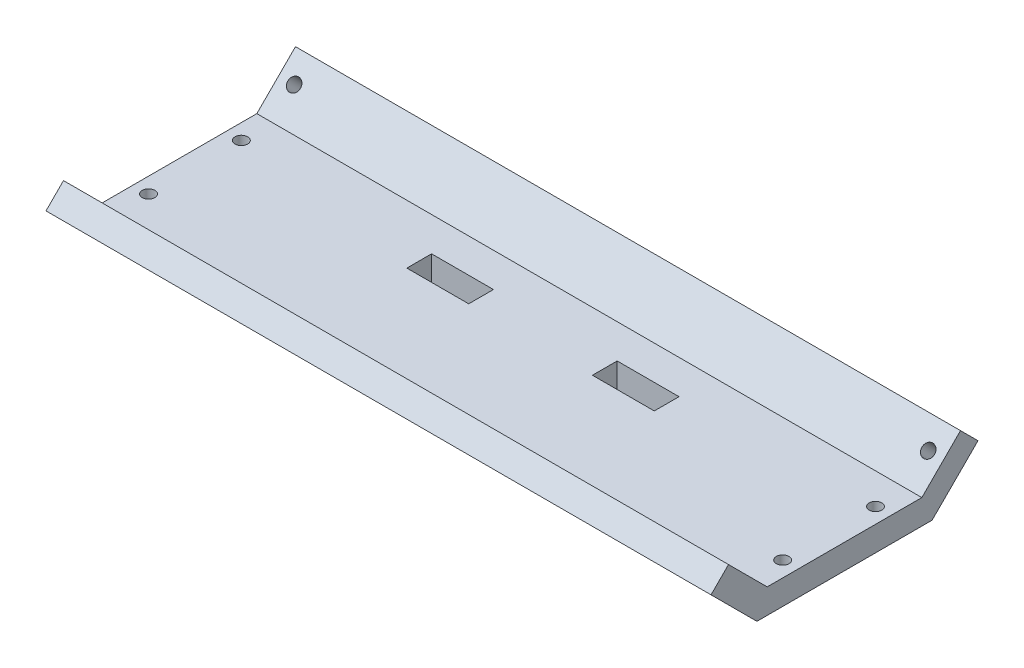
ISO-10303-21;
HEADER;
FILE_DESCRIPTION(('STEP AP214'),'2;1');
FILE_NAME('part.step','',(''),(''),'','','');
FILE_SCHEMA(('AUTOMOTIVE_DESIGN { 1 0 10303 214 1 1 1 1 }'));
ENDSEC;
DATA;
#1=APPLICATION_CONTEXT('core data for automotive mechanical design processes');
#2=APPLICATION_PROTOCOL_DEFINITION('international standard','automotive_design',2000,#1);
#3=PRODUCT_CONTEXT('',#1,'mechanical');
#4=PRODUCT('Part','Part','',(#3));
#5=PRODUCT_RELATED_PRODUCT_CATEGORY('part','',(#4));
#6=PRODUCT_DEFINITION_FORMATION('','',#4);
#7=PRODUCT_DEFINITION_CONTEXT('part definition',#1,'design');
#8=PRODUCT_DEFINITION('design','',#6,#7);
#9=PRODUCT_DEFINITION_SHAPE('','',#8);
#10=(LENGTH_UNIT() NAMED_UNIT(*) SI_UNIT(.MILLI.,.METRE.));
#11=(NAMED_UNIT(*) PLANE_ANGLE_UNIT() SI_UNIT($,.RADIAN.));
#12=(NAMED_UNIT(*) SI_UNIT($,.STERADIAN.) SOLID_ANGLE_UNIT());
#13=UNCERTAINTY_MEASURE_WITH_UNIT(LENGTH_MEASURE(1.E-05),#10,'distance_accuracy_value','');
#14=(GEOMETRIC_REPRESENTATION_CONTEXT(3) GLOBAL_UNCERTAINTY_ASSIGNED_CONTEXT((#13)) GLOBAL_UNIT_ASSIGNED_CONTEXT((#10,
#11,#12)) REPRESENTATION_CONTEXT('',''));
#15=CARTESIAN_POINT('',(0.,0.,0.));
#16=DIRECTION('',(0.,0.,1.));
#17=DIRECTION('',(1.,0.,0.));
#18=AXIS2_PLACEMENT_3D('',#15,#16,#17);
#19=CARTESIAN_POINT('',(107.5,12.4999999999999,37.5000000000001));
#20=DIRECTION('',(0.,-0.707106781186547,-0.707106781186548));
#21=DIRECTION('',(0.,0.707106781186548,-0.707106781186547));
#22=AXIS2_PLACEMENT_3D('',#19,#20,#21);
#23=PLANE('',#22);
#24=DIRECTION('',(0.,-0.707106781186548,0.707106781186547));
#25=VECTOR('',#24,1.);
#26=CARTESIAN_POINT('',(-107.5,12.4999999999999,37.5000000000001));
#27=LINE('',#26,#25);
#28=CARTESIAN_POINT('',(-107.5,12.4999999999999,37.5000000000001));
#29=VERTEX_POINT('',#28);
#30=CARTESIAN_POINT('',(-107.5,6.84314575050755,43.1568542494924));
#31=VERTEX_POINT('',#30);
#32=EDGE_CURVE('E266',#29,#31,#27,.T.);
#33=ORIENTED_EDGE('',*,*,#32,.T.);
#34=DIRECTION('',(-1.,0.,0.));
#35=VECTOR('',#34,1.);
#36=CARTESIAN_POINT('',(107.5,6.84314575050755,43.1568542494924));
#37=LINE('',#36,#35);
#38=CARTESIAN_POINT('',(107.5,6.84314575050755,43.1568542494924));
#39=VERTEX_POINT('',#38);
#40=EDGE_CURVE('E11',#39,#31,#37,.T.);
#41=ORIENTED_EDGE('',*,*,#40,.F.);
#42=DIRECTION('',(0.,-0.707106781186548,0.707106781186547));
#43=VECTOR('',#42,1.);
#44=CARTESIAN_POINT('',(107.5,12.4999999999999,37.5000000000001));
#45=LINE('',#44,#43);
#46=CARTESIAN_POINT('',(107.5,12.4999999999999,37.5000000000001));
#47=VERTEX_POINT('',#46);
#48=EDGE_CURVE('E267',#47,#39,#45,.T.);
#49=ORIENTED_EDGE('',*,*,#48,.F.);
#50=DIRECTION('',(-1.,0.,0.));
#51=VECTOR('',#50,1.);
#52=CARTESIAN_POINT('',(107.5,12.4999999999999,37.5000000000001));
#53=LINE('',#52,#51);
#54=EDGE_CURVE('E285',#47,#29,#53,.T.);
#55=ORIENTED_EDGE('',*,*,#54,.T.);
#56=EDGE_LOOP('',(#33,#41,#49,#55));
#57=FACE_BOUND('',#56,.T.);
#58=ADVANCED_FACE('F38',(#57),#23,.F.);
#59=CARTESIAN_POINT('',(107.5,-8.,28.313708498985));
#60=DIRECTION('',(0.,0.707106781186545,-0.707106781186551));
#61=DIRECTION('',(0.,0.707106781186551,0.707106781186545));
#62=AXIS2_PLACEMENT_3D('',#59,#60,#61);
#63=PLANE('',#62);
#64=CARTESIAN_POINT('',(-102.5,1.414213562373,37.7279220613579));
#65=DIRECTION('',(0.,0.707106781186545,-0.707106781186551));
#66=DIRECTION('',(0.,0.707106781186551,0.707106781186545));
#67=AXIS2_PLACEMENT_3D('',#64,#65,#66);
#68=CIRCLE('',#67,2.04999999999999);
#69=CARTESIAN_POINT('',(-102.5,2.86378246380542,39.1774909627903));
#70=VERTEX_POINT('',#69);
#71=EDGE_CURVE('E242',#70,#70,#68,.T.);
#72=ORIENTED_EDGE('',*,*,#71,.T.);
#73=EDGE_LOOP('',(#72));
#74=FACE_BOUND('',#73,.T.);
#75=CARTESIAN_POINT('',(102.5,1.414213562373,37.7279220613579));
#76=DIRECTION('',(0.,0.707106781186545,-0.707106781186551));
#77=DIRECTION('',(0.,0.707106781186551,0.707106781186545));
#78=AXIS2_PLACEMENT_3D('',#75,#76,#77);
#79=CIRCLE('',#78,2.04999999999999);
#80=CARTESIAN_POINT('',(102.5,2.86378246380542,39.1774909627903));
#81=VERTEX_POINT('',#80);
#82=EDGE_CURVE('E41',#81,#81,#79,.T.);
#83=ORIENTED_EDGE('',*,*,#82,.T.);
#84=EDGE_LOOP('',(#83));
#85=FACE_BOUND('',#84,.T.);
#86=DIRECTION('',(0.,-0.707106781186551,-0.707106781186545));
#87=VECTOR('',#86,1.);
#88=CARTESIAN_POINT('',(-107.5,-8.,28.313708498985));
#89=LINE('',#88,#87);
#90=CARTESIAN_POINT('',(-107.5,-8.,28.313708498985));
#91=VERTEX_POINT('',#90);
#92=EDGE_CURVE('E288',#31,#91,#89,.T.);
#93=ORIENTED_EDGE('',*,*,#92,.T.);
#94=DIRECTION('',(-1.,0.,0.));
#95=VECTOR('',#94,1.);
#96=CARTESIAN_POINT('',(107.5,-8.,28.313708498985));
#97=LINE('',#96,#95);
#98=CARTESIAN_POINT('',(107.5,-8.,28.313708498985));
#99=VERTEX_POINT('',#98);
#100=EDGE_CURVE('E46',#99,#91,#97,.T.);
#101=ORIENTED_EDGE('',*,*,#100,.F.);
#102=DIRECTION('',(0.,-0.707106781186551,-0.707106781186545));
#103=VECTOR('',#102,1.);
#104=CARTESIAN_POINT('',(107.5,-8.,28.313708498985));
#105=LINE('',#104,#103);
#106=EDGE_CURVE('E270',#39,#99,#105,.T.);
#107=ORIENTED_EDGE('',*,*,#106,.F.);
#108=ORIENTED_EDGE('',*,*,#40,.T.);
#109=EDGE_LOOP('',(#93,#101,#107,#108));
#110=FACE_BOUND('',#109,.T.);
#111=ADVANCED_FACE('F345',(#74,#85,#110),#63,.F.);
#112=CARTESIAN_POINT('',(107.5,-8.,28.313708498985));
#113=DIRECTION('',(0.,1.,0.));
#114=DIRECTION('',(0.,0.,1.));
#115=AXIS2_PLACEMENT_3D('',#112,#113,#114);
#116=PLANE('',#115);
#117=DIRECTION('',(1.,0.,0.));
#118=VECTOR('',#117,1.);
#119=CARTESIAN_POINT('',(20.,-8.,-6.));
#120=LINE('',#119,#118);
#121=CARTESIAN_POINT('',(20.,-8.,-6.));
#122=VERTEX_POINT('',#121);
#123=CARTESIAN_POINT('',(40.,-8.,-6.));
#124=VERTEX_POINT('',#123);
#125=EDGE_CURVE('E163',#122,#124,#120,.T.);
#126=ORIENTED_EDGE('',*,*,#125,.T.);
#127=DIRECTION('',(0.,0.,-1.));
#128=VECTOR('',#127,1.);
#129=CARTESIAN_POINT('',(40.,-8.,-14.));
#130=LINE('',#129,#128);
#131=CARTESIAN_POINT('',(40.,-8.,-14.));
#132=VERTEX_POINT('',#131);
#133=EDGE_CURVE('E155',#124,#132,#130,.T.);
#134=ORIENTED_EDGE('',*,*,#133,.T.);
#135=DIRECTION('',(-1.,0.,0.));
#136=VECTOR('',#135,1.);
#137=CARTESIAN_POINT('',(20.,-8.,-14.));
#138=LINE('',#137,#136);
#139=CARTESIAN_POINT('',(20.,-8.,-14.));
#140=VERTEX_POINT('',#139);
#141=EDGE_CURVE('E166',#132,#140,#138,.T.);
#142=ORIENTED_EDGE('',*,*,#141,.T.);
#143=DIRECTION('',(0.,0.,1.));
#144=VECTOR('',#143,1.);
#145=CARTESIAN_POINT('',(20.,-8.,-14.));
#146=LINE('',#145,#144);
#147=EDGE_CURVE('E53',#140,#122,#146,.T.);
#148=ORIENTED_EDGE('',*,*,#147,.T.);
#149=EDGE_LOOP('',(#126,#134,#142,#148));
#150=FACE_BOUND('',#149,.T.);
#151=DIRECTION('',(1.,0.,0.));
#152=VECTOR('',#151,1.);
#153=CARTESIAN_POINT('',(-40.,-8.,-6.));
#154=LINE('',#153,#152);
#155=CARTESIAN_POINT('',(-40.,-8.,-6.));
#156=VERTEX_POINT('',#155);
#157=CARTESIAN_POINT('',(-20.,-8.,-6.));
#158=VERTEX_POINT('',#157);
#159=EDGE_CURVE('E196',#156,#158,#154,.T.);
#160=ORIENTED_EDGE('',*,*,#159,.T.);
#161=DIRECTION('',(0.,0.,-1.));
#162=VECTOR('',#161,1.);
#163=CARTESIAN_POINT('',(-20.,-8.,-14.));
#164=LINE('',#163,#162);
#165=CARTESIAN_POINT('',(-20.,-8.,-14.));
#166=VERTEX_POINT('',#165);
#167=EDGE_CURVE('E207',#158,#166,#164,.T.);
#168=ORIENTED_EDGE('',*,*,#167,.T.);
#169=DIRECTION('',(-1.,0.,0.));
#170=VECTOR('',#169,1.);
#171=CARTESIAN_POINT('',(-40.,-8.,-14.));
#172=LINE('',#171,#170);
#173=CARTESIAN_POINT('',(-40.,-8.,-14.));
#174=VERTEX_POINT('',#173);
#175=EDGE_CURVE('E217',#166,#174,#172,.T.);
#176=ORIENTED_EDGE('',*,*,#175,.T.);
#177=DIRECTION('',(0.,0.,1.));
#178=VECTOR('',#177,1.);
#179=CARTESIAN_POINT('',(-40.,-8.,-14.));
#180=LINE('',#179,#178);
#181=EDGE_CURVE('E61',#174,#156,#180,.T.);
#182=ORIENTED_EDGE('',*,*,#181,.T.);
#183=EDGE_LOOP('',(#160,#168,#176,#182));
#184=FACE_BOUND('',#183,.T.);
#185=CARTESIAN_POINT('',(-102.5,-8.,-15.0000000000001));
#186=DIRECTION('',(0.,1.,0.));
#187=DIRECTION('',(0.,0.,1.));
#188=AXIS2_PLACEMENT_3D('',#185,#186,#187);
#189=CIRCLE('',#188,2.05);
#190=CARTESIAN_POINT('',(-102.5,-8.,-12.9500000000001));
#191=VERTEX_POINT('',#190);
#192=EDGE_CURVE('E230',#191,#191,#189,.T.);
#193=ORIENTED_EDGE('',*,*,#192,.T.);
#194=EDGE_LOOP('',(#193));
#195=FACE_BOUND('',#194,.T.);
#196=CARTESIAN_POINT('',(-102.5,-8.,15.0000000000001));
#197=DIRECTION('',(0.,1.,0.));
#198=DIRECTION('',(0.,0.,1.));
#199=AXIS2_PLACEMENT_3D('',#196,#197,#198);
#200=CIRCLE('',#199,2.05);
#201=CARTESIAN_POINT('',(-102.5,-8.,17.0500000000001));
#202=VERTEX_POINT('',#201);
#203=EDGE_CURVE('E236',#202,#202,#200,.T.);
#204=ORIENTED_EDGE('',*,*,#203,.T.);
#205=EDGE_LOOP('',(#204));
#206=FACE_BOUND('',#205,.T.);
#207=CARTESIAN_POINT('',(102.5,-8.,15.0000000000001));
#208=DIRECTION('',(0.,1.,0.));
#209=DIRECTION('',(0.,0.,1.));
#210=AXIS2_PLACEMENT_3D('',#207,#208,#209);
#211=CIRCLE('',#210,2.05);
#212=CARTESIAN_POINT('',(102.5,-8.,17.0500000000001));
#213=VERTEX_POINT('',#212);
#214=EDGE_CURVE('E251',#213,#213,#211,.T.);
#215=ORIENTED_EDGE('',*,*,#214,.T.);
#216=EDGE_LOOP('',(#215));
#217=FACE_BOUND('',#216,.T.);
#218=CARTESIAN_POINT('',(102.5,-8.,-15.0000000000001));
#219=DIRECTION('',(0.,1.,0.));
#220=DIRECTION('',(0.,0.,1.));
#221=AXIS2_PLACEMENT_3D('',#218,#219,#220);
#222=CIRCLE('',#221,2.05);
#223=CARTESIAN_POINT('',(102.5,-8.,-12.9500000000001));
#224=VERTEX_POINT('',#223);
#225=EDGE_CURVE('E257',#224,#224,#222,.T.);
#226=ORIENTED_EDGE('',*,*,#225,.T.);
#227=EDGE_LOOP('',(#226));
#228=FACE_BOUND('',#227,.T.);
#229=DIRECTION('',(0.,0.,-1.));
#230=VECTOR('',#229,1.);
#231=CARTESIAN_POINT('',(-107.5,-8.,28.313708498985));
#232=LINE('',#231,#230);
#233=CARTESIAN_POINT('',(-107.5,-8.,-28.3137084989848));
#234=VERTEX_POINT('',#233);
#235=EDGE_CURVE('E290',#91,#234,#232,.T.);
#236=ORIENTED_EDGE('',*,*,#235,.T.);
#237=DIRECTION('',(-1.,0.,0.));
#238=VECTOR('',#237,1.);
#239=CARTESIAN_POINT('',(107.5,-8.,-28.3137084989848));
#240=LINE('',#239,#238);
#241=CARTESIAN_POINT('',(107.5,-8.,-28.3137084989848));
#242=VERTEX_POINT('',#241);
#243=EDGE_CURVE('E315',#242,#234,#240,.T.);
#244=ORIENTED_EDGE('',*,*,#243,.F.);
#245=DIRECTION('',(0.,0.,-1.));
#246=VECTOR('',#245,1.);
#247=CARTESIAN_POINT('',(107.5,-8.,28.313708498985));
#248=LINE('',#247,#246);
#249=EDGE_CURVE('E273',#99,#242,#248,.T.);
#250=ORIENTED_EDGE('',*,*,#249,.F.);
#251=ORIENTED_EDGE('',*,*,#100,.T.);
#252=EDGE_LOOP('',(#236,#244,#250,#251));
#253=FACE_BOUND('',#252,.T.);
#254=ADVANCED_FACE('F170',(#150,#184,#195,#206,#217,#228,#253),#116,.F.);
#255=CARTESIAN_POINT('',(107.5,-8.,-28.3137084989848));
#256=DIRECTION('',(0.,0.707106781186547,0.707106781186547));
#257=DIRECTION('',(0.,-0.707106781186548,0.707106781186548));
#258=AXIS2_PLACEMENT_3D('',#255,#256,#257);
#259=PLANE('',#258);
#260=CARTESIAN_POINT('',(-102.5,1.41421356237307,-37.7279220613579));
#261=DIRECTION('',(0.,0.707106781186547,0.707106781186547));
#262=DIRECTION('',(0.,-0.707106781186548,0.707106781186548));
#263=AXIS2_PLACEMENT_3D('',#260,#261,#262);
#264=CIRCLE('',#263,2.04999999999999);
#265=CARTESIAN_POINT('',(-102.5,-0.0353553390593424,-36.2783531599255));
#266=VERTEX_POINT('',#265);
#267=EDGE_CURVE('E224',#266,#266,#264,.T.);
#268=ORIENTED_EDGE('',*,*,#267,.T.);
#269=EDGE_LOOP('',(#268));
#270=FACE_BOUND('',#269,.T.);
#271=CARTESIAN_POINT('',(102.5,1.41421356237306,-37.7279220613579));
#272=DIRECTION('',(0.,0.707106781186547,0.707106781186547));
#273=DIRECTION('',(0.,-0.707106781186548,0.707106781186548));
#274=AXIS2_PLACEMENT_3D('',#271,#272,#273);
#275=CIRCLE('',#274,2.04999999999999);
#276=CARTESIAN_POINT('',(102.5,-0.0353553390593563,-36.2783531599255));
#277=VERTEX_POINT('',#276);
#278=EDGE_CURVE('E263',#277,#277,#275,.T.);
#279=ORIENTED_EDGE('',*,*,#278,.T.);
#280=EDGE_LOOP('',(#279));
#281=FACE_BOUND('',#280,.T.);
#282=DIRECTION('',(0.,0.707106781186547,-0.707106781186547));
#283=VECTOR('',#282,1.);
#284=CARTESIAN_POINT('',(-107.5,-8.,-28.3137084989848));
#285=LINE('',#284,#283);
#286=CARTESIAN_POINT('',(-107.5,6.84314575050755,-43.1568542494924));
#287=VERTEX_POINT('',#286);
#288=EDGE_CURVE('E292',#234,#287,#285,.T.);
#289=ORIENTED_EDGE('',*,*,#288,.T.);
#290=DIRECTION('',(-1.,0.,0.));
#291=VECTOR('',#290,1.);
#292=CARTESIAN_POINT('',(107.5,6.84314575050755,-43.1568542494924));
#293=LINE('',#292,#291);
#294=CARTESIAN_POINT('',(107.5,6.84314575050755,-43.1568542494924));
#295=VERTEX_POINT('',#294);
#296=EDGE_CURVE('E312',#295,#287,#293,.T.);
#297=ORIENTED_EDGE('',*,*,#296,.F.);
#298=DIRECTION('',(0.,0.707106781186547,-0.707106781186547));
#299=VECTOR('',#298,1.);
#300=CARTESIAN_POINT('',(107.5,-8.,-28.3137084989848));
#301=LINE('',#300,#299);
#302=EDGE_CURVE('E275',#242,#295,#301,.T.);
#303=ORIENTED_EDGE('',*,*,#302,.F.);
#304=ORIENTED_EDGE('',*,*,#243,.T.);
#305=EDGE_LOOP('',(#289,#297,#303,#304));
#306=FACE_BOUND('',#305,.T.);
#307=ADVANCED_FACE('F333',(#270,#281,#306),#259,.F.);
#308=CARTESIAN_POINT('',(107.5,12.5,-37.5));
#309=DIRECTION('',(0.,-0.707106781186547,0.707106781186548));
#310=DIRECTION('',(0.,-0.707106781186548,-0.707106781186547));
#311=AXIS2_PLACEMENT_3D('',#308,#309,#310);
#312=PLANE('',#311);
#313=DIRECTION('',(0.,0.707106781186548,0.707106781186547));
#314=VECTOR('',#313,1.);
#315=CARTESIAN_POINT('',(-107.5,12.5,-37.5));
#316=LINE('',#315,#314);
#317=CARTESIAN_POINT('',(-107.5,12.5,-37.5));
#318=VERTEX_POINT('',#317);
#319=EDGE_CURVE('E294',#287,#318,#316,.T.);
#320=ORIENTED_EDGE('',*,*,#319,.T.);
#321=DIRECTION('',(-1.,0.,0.));
#322=VECTOR('',#321,1.);
#323=CARTESIAN_POINT('',(107.5,12.5,-37.5));
#324=LINE('',#323,#322);
#325=CARTESIAN_POINT('',(107.5,12.5,-37.5));
#326=VERTEX_POINT('',#325);
#327=EDGE_CURVE('E309',#326,#318,#324,.T.);
#328=ORIENTED_EDGE('',*,*,#327,.F.);
#329=DIRECTION('',(0.,0.707106781186548,0.707106781186547));
#330=VECTOR('',#329,1.);
#331=CARTESIAN_POINT('',(107.5,12.5,-37.5));
#332=LINE('',#331,#330);
#333=EDGE_CURVE('E277',#295,#326,#332,.T.);
#334=ORIENTED_EDGE('',*,*,#333,.F.);
#335=ORIENTED_EDGE('',*,*,#296,.T.);
#336=EDGE_LOOP('',(#320,#328,#334,#335));
#337=FACE_BOUND('',#336,.T.);
#338=ADVANCED_FACE('F337',(#337),#312,.F.);
#339=CARTESIAN_POINT('',(107.5,0.,-25.0000000000001));
#340=DIRECTION('',(0.,-0.707106781186546,-0.707106781186549));
#341=DIRECTION('',(0.,0.707106781186549,-0.707106781186546));
#342=AXIS2_PLACEMENT_3D('',#339,#340,#341);
#343=PLANE('',#342);
#344=CARTESIAN_POINT('',(-102.5,7.07106781186545,-32.0710678118655));
#345=DIRECTION('',(0.,0.707106781186546,0.707106781186549));
#346=DIRECTION('',(0.,-0.707106781186549,0.707106781186546));
#347=AXIS2_PLACEMENT_3D('',#344,#345,#346);
#348=CIRCLE('',#347,2.04999999999998);
#349=CARTESIAN_POINT('',(-102.5,5.62149891043304,-30.6214989104331));
#350=VERTEX_POINT('',#349);
#351=EDGE_CURVE('E189',#350,#350,#348,.T.);
#352=ORIENTED_EDGE('',*,*,#351,.F.);
#353=EDGE_LOOP('',(#352));
#354=FACE_BOUND('',#353,.T.);
#355=CARTESIAN_POINT('',(102.5,7.07106781186544,-32.0710678118655));
#356=DIRECTION('',(0.,0.707106781186546,0.707106781186549));
#357=DIRECTION('',(0.,-0.707106781186549,0.707106781186546));
#358=AXIS2_PLACEMENT_3D('',#355,#356,#357);
#359=CIRCLE('',#358,2.04999999999998);
#360=CARTESIAN_POINT('',(102.5,5.62149891043302,-30.6214989104331));
#361=VERTEX_POINT('',#360);
#362=EDGE_CURVE('E260',#361,#361,#359,.T.);
#363=ORIENTED_EDGE('',*,*,#362,.F.);
#364=EDGE_LOOP('',(#363));
#365=FACE_BOUND('',#364,.T.);
#366=DIRECTION('',(0.,-0.707106781186549,0.707106781186546));
#367=VECTOR('',#366,1.);
#368=CARTESIAN_POINT('',(-107.5,0.,-25.0000000000001));
#369=LINE('',#368,#367);
#370=CARTESIAN_POINT('',(-107.5,0.,-25.0000000000001));
#371=VERTEX_POINT('',#370);
#372=EDGE_CURVE('E296',#318,#371,#369,.T.);
#373=ORIENTED_EDGE('',*,*,#372,.T.);
#374=DIRECTION('',(-1.,0.,0.));
#375=VECTOR('',#374,1.);
#376=CARTESIAN_POINT('',(107.5,0.,-25.0000000000001));
#377=LINE('',#376,#375);
#378=CARTESIAN_POINT('',(107.5,0.,-25.0000000000001));
#379=VERTEX_POINT('',#378);
#380=EDGE_CURVE('E306',#379,#371,#377,.T.);
#381=ORIENTED_EDGE('',*,*,#380,.F.);
#382=DIRECTION('',(0.,-0.707106781186549,0.707106781186546));
#383=VECTOR('',#382,1.);
#384=CARTESIAN_POINT('',(107.5,0.,-25.0000000000001));
#385=LINE('',#384,#383);
#386=EDGE_CURVE('E279',#326,#379,#385,.T.);
#387=ORIENTED_EDGE('',*,*,#386,.F.);
#388=ORIENTED_EDGE('',*,*,#327,.T.);
#389=EDGE_LOOP('',(#373,#381,#387,#388));
#390=FACE_BOUND('',#389,.T.);
#391=ADVANCED_FACE('F358',(#354,#365,#390),#343,.F.);
#392=CARTESIAN_POINT('',(107.5,0.,25.0000000000001));
#393=DIRECTION('',(0.,-1.,0.));
#394=DIRECTION('',(0.,0.,-1.));
#395=AXIS2_PLACEMENT_3D('',#392,#393,#394);
#396=PLANE('',#395);
#397=DIRECTION('',(-1.,0.,0.));
#398=VECTOR('',#397,1.);
#399=CARTESIAN_POINT('',(20.,0.,-14.));
#400=LINE('',#399,#398);
#401=CARTESIAN_POINT('',(40.,0.,-14.));
#402=VERTEX_POINT('',#401);
#403=CARTESIAN_POINT('',(20.,0.,-14.));
#404=VERTEX_POINT('',#403);
#405=EDGE_CURVE('E182',#402,#404,#400,.T.);
#406=ORIENTED_EDGE('',*,*,#405,.F.);
#407=DIRECTION('',(0.,0.,-1.));
#408=VECTOR('',#407,1.);
#409=CARTESIAN_POINT('',(40.,0.,-14.));
#410=LINE('',#409,#408);
#411=CARTESIAN_POINT('',(40.,0.,-6.));
#412=VERTEX_POINT('',#411);
#413=EDGE_CURVE('E158',#412,#402,#410,.T.);
#414=ORIENTED_EDGE('',*,*,#413,.F.);
#415=DIRECTION('',(1.,0.,0.));
#416=VECTOR('',#415,1.);
#417=CARTESIAN_POINT('',(20.,0.,-6.));
#418=LINE('',#417,#416);
#419=CARTESIAN_POINT('',(20.,0.,-6.));
#420=VERTEX_POINT('',#419);
#421=EDGE_CURVE('E173',#420,#412,#418,.T.);
#422=ORIENTED_EDGE('',*,*,#421,.F.);
#423=DIRECTION('',(0.,0.,1.));
#424=VECTOR('',#423,1.);
#425=CARTESIAN_POINT('',(20.,0.,-14.));
#426=LINE('',#425,#424);
#427=EDGE_CURVE('E176',#404,#420,#426,.T.);
#428=ORIENTED_EDGE('',*,*,#427,.F.);
#429=EDGE_LOOP('',(#406,#414,#422,#428));
#430=FACE_BOUND('',#429,.T.);
#431=DIRECTION('',(-1.,0.,0.));
#432=VECTOR('',#431,1.);
#433=CARTESIAN_POINT('',(-40.,0.,-14.));
#434=LINE('',#433,#432);
#435=CARTESIAN_POINT('',(-20.,0.,-14.));
#436=VERTEX_POINT('',#435);
#437=CARTESIAN_POINT('',(-40.,0.,-14.));
#438=VERTEX_POINT('',#437);
#439=EDGE_CURVE('E210',#436,#438,#434,.T.);
#440=ORIENTED_EDGE('',*,*,#439,.F.);
#441=DIRECTION('',(0.,0.,-1.));
#442=VECTOR('',#441,1.);
#443=CARTESIAN_POINT('',(-20.,0.,-14.));
#444=LINE('',#443,#442);
#445=CARTESIAN_POINT('',(-20.,0.,-6.));
#446=VERTEX_POINT('',#445);
#447=EDGE_CURVE('E183',#446,#436,#444,.T.);
#448=ORIENTED_EDGE('',*,*,#447,.F.);
#449=DIRECTION('',(1.,0.,0.));
#450=VECTOR('',#449,1.);
#451=CARTESIAN_POINT('',(-40.,0.,-6.));
#452=LINE('',#451,#450);
#453=CARTESIAN_POINT('',(-40.,0.,-6.));
#454=VERTEX_POINT('',#453);
#455=EDGE_CURVE('E203',#454,#446,#452,.T.);
#456=ORIENTED_EDGE('',*,*,#455,.F.);
#457=DIRECTION('',(0.,0.,1.));
#458=VECTOR('',#457,1.);
#459=CARTESIAN_POINT('',(-40.,0.,-14.));
#460=LINE('',#459,#458);
#461=EDGE_CURVE('E206',#438,#454,#460,.T.);
#462=ORIENTED_EDGE('',*,*,#461,.F.);
#463=EDGE_LOOP('',(#440,#448,#456,#462));
#464=FACE_BOUND('',#463,.T.);
#465=CARTESIAN_POINT('',(-102.5,0.,-15.0000000000001));
#466=DIRECTION('',(0.,1.,0.));
#467=DIRECTION('',(0.,0.,1.));
#468=AXIS2_PLACEMENT_3D('',#465,#466,#467);
#469=CIRCLE('',#468,2.04999999999998);
#470=CARTESIAN_POINT('',(-102.5,0.,-12.9500000000001));
#471=VERTEX_POINT('',#470);
#472=EDGE_CURVE('E227',#471,#471,#469,.T.);
#473=ORIENTED_EDGE('',*,*,#472,.F.);
#474=EDGE_LOOP('',(#473));
#475=FACE_BOUND('',#474,.T.);
#476=CARTESIAN_POINT('',(-102.5,0.,15.0000000000001));
#477=DIRECTION('',(0.,1.,0.));
#478=DIRECTION('',(0.,0.,1.));
#479=AXIS2_PLACEMENT_3D('',#476,#477,#478);
#480=CIRCLE('',#479,2.04999999999998);
#481=CARTESIAN_POINT('',(-102.5,0.,17.0500000000001));
#482=VERTEX_POINT('',#481);
#483=EDGE_CURVE('E233',#482,#482,#480,.T.);
#484=ORIENTED_EDGE('',*,*,#483,.F.);
#485=EDGE_LOOP('',(#484));
#486=FACE_BOUND('',#485,.T.);
#487=CARTESIAN_POINT('',(102.5,0.,15.0000000000001));
#488=DIRECTION('',(0.,1.,0.));
#489=DIRECTION('',(0.,0.,1.));
#490=AXIS2_PLACEMENT_3D('',#487,#488,#489);
#491=CIRCLE('',#490,2.04999999999998);
#492=CARTESIAN_POINT('',(102.5,0.,17.0500000000001));
#493=VERTEX_POINT('',#492);
#494=EDGE_CURVE('E248',#493,#493,#491,.T.);
#495=ORIENTED_EDGE('',*,*,#494,.F.);
#496=EDGE_LOOP('',(#495));
#497=FACE_BOUND('',#496,.T.);
#498=CARTESIAN_POINT('',(102.5,0.,-15.0000000000001));
#499=DIRECTION('',(0.,1.,0.));
#500=DIRECTION('',(0.,0.,1.));
#501=AXIS2_PLACEMENT_3D('',#498,#499,#500);
#502=CIRCLE('',#501,2.04999999999998);
#503=CARTESIAN_POINT('',(102.5,0.,-12.9500000000001));
#504=VERTEX_POINT('',#503);
#505=EDGE_CURVE('E254',#504,#504,#502,.T.);
#506=ORIENTED_EDGE('',*,*,#505,.F.);
#507=EDGE_LOOP('',(#506));
#508=FACE_BOUND('',#507,.T.);
#509=DIRECTION('',(0.,0.,1.));
#510=VECTOR('',#509,1.);
#511=CARTESIAN_POINT('',(-107.5,0.,25.0000000000001));
#512=LINE('',#511,#510);
#513=CARTESIAN_POINT('',(-107.5,0.,25.0000000000001));
#514=VERTEX_POINT('',#513);
#515=EDGE_CURVE('E298',#371,#514,#512,.T.);
#516=ORIENTED_EDGE('',*,*,#515,.T.);
#517=DIRECTION('',(-1.,0.,0.));
#518=VECTOR('',#517,1.);
#519=CARTESIAN_POINT('',(107.5,0.,25.0000000000001));
#520=LINE('',#519,#518);
#521=CARTESIAN_POINT('',(107.5,0.,25.0000000000001));
#522=VERTEX_POINT('',#521);
#523=EDGE_CURVE('E303',#522,#514,#520,.T.);
#524=ORIENTED_EDGE('',*,*,#523,.F.);
#525=DIRECTION('',(0.,0.,1.));
#526=VECTOR('',#525,1.);
#527=CARTESIAN_POINT('',(107.5,0.,25.0000000000001));
#528=LINE('',#527,#526);
#529=EDGE_CURVE('E281',#379,#522,#528,.T.);
#530=ORIENTED_EDGE('',*,*,#529,.F.);
#531=ORIENTED_EDGE('',*,*,#380,.T.);
#532=EDGE_LOOP('',(#516,#524,#530,#531));
#533=FACE_BOUND('',#532,.T.);
#534=ADVANCED_FACE('F356',(#430,#464,#475,#486,#497,#508,#533),#396,.F.);
#535=CARTESIAN_POINT('',(107.5,0.,25.0000000000001));
#536=DIRECTION('',(0.,-0.707106781186551,0.707106781186544));
#537=DIRECTION('',(0.,-0.707106781186544,-0.707106781186551));
#538=AXIS2_PLACEMENT_3D('',#535,#536,#537);
#539=PLANE('',#538);
#540=CARTESIAN_POINT('',(-102.5,7.0710678118654,32.0710678118655));
#541=DIRECTION('',(0.,0.707106781186551,-0.707106781186544));
#542=DIRECTION('',(0.,0.707106781186544,0.707106781186551));
#543=AXIS2_PLACEMENT_3D('',#540,#541,#542);
#544=CIRCLE('',#543,2.04999999999998);
#545=CARTESIAN_POINT('',(-102.5,8.52063671329781,33.520636713298));
#546=VERTEX_POINT('',#545);
#547=EDGE_CURVE('E239',#546,#546,#544,.T.);
#548=ORIENTED_EDGE('',*,*,#547,.F.);
#549=EDGE_LOOP('',(#548));
#550=FACE_BOUND('',#549,.T.);
#551=CARTESIAN_POINT('',(102.5,7.0710678118654,32.0710678118655));
#552=DIRECTION('',(0.,0.707106781186551,-0.707106781186544));
#553=DIRECTION('',(0.,0.707106781186544,0.707106781186551));
#554=AXIS2_PLACEMENT_3D('',#551,#552,#553);
#555=CIRCLE('',#554,2.04999999999998);
#556=CARTESIAN_POINT('',(102.5,8.5206367132978,33.520636713298));
#557=VERTEX_POINT('',#556);
#558=EDGE_CURVE('E245',#557,#557,#555,.T.);
#559=ORIENTED_EDGE('',*,*,#558,.F.);
#560=EDGE_LOOP('',(#559));
#561=FACE_BOUND('',#560,.T.);
#562=DIRECTION('',(0.,0.707106781186544,0.707106781186551));
#563=VECTOR('',#562,1.);
#564=CARTESIAN_POINT('',(-107.5,0.,25.0000000000001));
#565=LINE('',#564,#563);
#566=EDGE_CURVE('E271',#514,#29,#565,.T.);
#567=ORIENTED_EDGE('',*,*,#566,.T.);
#568=ORIENTED_EDGE('',*,*,#54,.F.);
#569=DIRECTION('',(0.,0.707106781186544,0.707106781186551));
#570=VECTOR('',#569,1.);
#571=CARTESIAN_POINT('',(107.5,0.,25.0000000000001));
#572=LINE('',#571,#570);
#573=EDGE_CURVE('E283',#522,#47,#572,.T.);
#574=ORIENTED_EDGE('',*,*,#573,.F.);
#575=ORIENTED_EDGE('',*,*,#523,.T.);
#576=EDGE_LOOP('',(#567,#568,#574,#575));
#577=FACE_BOUND('',#576,.T.);
#578=ADVANCED_FACE('F351',(#550,#561,#577),#539,.F.);
#579=CARTESIAN_POINT('',(107.5,0.,0.));
#580=DIRECTION('',(-1.,0.,0.));
#581=DIRECTION('',(0.,0.,1.));
#582=AXIS2_PLACEMENT_3D('',#579,#580,#581);
#583=PLANE('',#582);
#584=ORIENTED_EDGE('',*,*,#48,.T.);
#585=ORIENTED_EDGE('',*,*,#106,.T.);
#586=ORIENTED_EDGE('',*,*,#249,.T.);
#587=ORIENTED_EDGE('',*,*,#302,.T.);
#588=ORIENTED_EDGE('',*,*,#333,.T.);
#589=ORIENTED_EDGE('',*,*,#386,.T.);
#590=ORIENTED_EDGE('',*,*,#529,.T.);
#591=ORIENTED_EDGE('',*,*,#573,.T.);
#592=EDGE_LOOP('',(#584,#585,#586,#587,#588,#589,#590,#591));
#593=FACE_BOUND('',#592,.T.);
#594=ADVANCED_FACE('F341',(#593),#583,.F.);
#595=CARTESIAN_POINT('',(-107.5,0.,0.));
#596=DIRECTION('',(-1.,0.,0.));
#597=DIRECTION('',(0.,0.,1.));
#598=AXIS2_PLACEMENT_3D('',#595,#596,#597);
#599=PLANE('',#598);
#600=ORIENTED_EDGE('',*,*,#32,.F.);
#601=ORIENTED_EDGE('',*,*,#566,.F.);
#602=ORIENTED_EDGE('',*,*,#515,.F.);
#603=ORIENTED_EDGE('',*,*,#372,.F.);
#604=ORIENTED_EDGE('',*,*,#319,.F.);
#605=ORIENTED_EDGE('',*,*,#288,.F.);
#606=ORIENTED_EDGE('',*,*,#235,.F.);
#607=ORIENTED_EDGE('',*,*,#92,.F.);
#608=EDGE_LOOP('',(#600,#601,#602,#603,#604,#605,#606,#607));
#609=FACE_BOUND('',#608,.T.);
#610=ADVANCED_FACE('F328',(#609),#599,.T.);
#611=CARTESIAN_POINT('',(102.5,7.07106781186544,-32.0710678118655));
#612=DIRECTION('',(0.,0.707106781186546,0.707106781186549));
#613=DIRECTION('',(0.,-0.707106781186549,0.707106781186546));
#614=AXIS2_PLACEMENT_3D('',#611,#612,#613);
#615=CYLINDRICAL_SURFACE('',#614,2.04999999999999);
#616=ORIENTED_EDGE('',*,*,#362,.T.);
#617=EDGE_LOOP('',(#616));
#618=FACE_BOUND('',#617,.T.);
#619=ORIENTED_EDGE('',*,*,#278,.F.);
#620=EDGE_LOOP('',(#619));
#621=FACE_BOUND('',#620,.T.);
#622=ADVANCED_FACE('F392',(#618,#621),#615,.F.);
#623=CARTESIAN_POINT('',(102.5,0.,-15.0000000000001));
#624=DIRECTION('',(0.,1.,0.));
#625=DIRECTION('',(0.,0.,1.));
#626=AXIS2_PLACEMENT_3D('',#623,#624,#625);
#627=CYLINDRICAL_SURFACE('',#626,2.04999999999999);
#628=ORIENTED_EDGE('',*,*,#225,.F.);
#629=EDGE_LOOP('',(#628));
#630=FACE_BOUND('',#629,.T.);
#631=ORIENTED_EDGE('',*,*,#505,.T.);
#632=EDGE_LOOP('',(#631));
#633=FACE_BOUND('',#632,.T.);
#634=ADVANCED_FACE('F394',(#630,#633),#627,.F.);
#635=CARTESIAN_POINT('',(102.5,0.,15.0000000000001));
#636=DIRECTION('',(0.,1.,0.));
#637=DIRECTION('',(0.,0.,1.));
#638=AXIS2_PLACEMENT_3D('',#635,#636,#637);
#639=CYLINDRICAL_SURFACE('',#638,2.04999999999999);
#640=ORIENTED_EDGE('',*,*,#214,.F.);
#641=EDGE_LOOP('',(#640));
#642=FACE_BOUND('',#641,.T.);
#643=ORIENTED_EDGE('',*,*,#494,.T.);
#644=EDGE_LOOP('',(#643));
#645=FACE_BOUND('',#644,.T.);
#646=ADVANCED_FACE('F400',(#642,#645),#639,.F.);
#647=CARTESIAN_POINT('',(102.5,7.0710678118654,32.0710678118655));
#648=DIRECTION('',(0.,0.707106781186551,-0.707106781186544));
#649=DIRECTION('',(0.,0.707106781186544,0.707106781186551));
#650=AXIS2_PLACEMENT_3D('',#647,#648,#649);
#651=CYLINDRICAL_SURFACE('',#650,2.04999999999999);
#652=ORIENTED_EDGE('',*,*,#558,.T.);
#653=EDGE_LOOP('',(#652));
#654=FACE_BOUND('',#653,.T.);
#655=ORIENTED_EDGE('',*,*,#82,.F.);
#656=EDGE_LOOP('',(#655));
#657=FACE_BOUND('',#656,.T.);
#658=ADVANCED_FACE('F415',(#654,#657),#651,.F.);
#659=CARTESIAN_POINT('',(-102.5,7.0710678118654,32.0710678118655));
#660=DIRECTION('',(0.,0.707106781186551,-0.707106781186544));
#661=DIRECTION('',(0.,0.707106781186544,0.707106781186551));
#662=AXIS2_PLACEMENT_3D('',#659,#660,#661);
#663=CYLINDRICAL_SURFACE('',#662,2.04999999999999);
#664=ORIENTED_EDGE('',*,*,#547,.T.);
#665=EDGE_LOOP('',(#664));
#666=FACE_BOUND('',#665,.T.);
#667=ORIENTED_EDGE('',*,*,#71,.F.);
#668=EDGE_LOOP('',(#667));
#669=FACE_BOUND('',#668,.T.);
#670=ADVANCED_FACE('F418',(#666,#669),#663,.F.);
#671=CARTESIAN_POINT('',(-102.5,0.,15.0000000000001));
#672=DIRECTION('',(0.,1.,0.));
#673=DIRECTION('',(0.,0.,1.));
#674=AXIS2_PLACEMENT_3D('',#671,#672,#673);
#675=CYLINDRICAL_SURFACE('',#674,2.04999999999999);
#676=ORIENTED_EDGE('',*,*,#203,.F.);
#677=EDGE_LOOP('',(#676));
#678=FACE_BOUND('',#677,.T.);
#679=ORIENTED_EDGE('',*,*,#483,.T.);
#680=EDGE_LOOP('',(#679));
#681=FACE_BOUND('',#680,.T.);
#682=ADVANCED_FACE('F426',(#678,#681),#675,.F.);
#683=CARTESIAN_POINT('',(-102.5,0.,-15.0000000000001));
#684=DIRECTION('',(0.,1.,0.));
#685=DIRECTION('',(0.,0.,1.));
#686=AXIS2_PLACEMENT_3D('',#683,#684,#685);
#687=CYLINDRICAL_SURFACE('',#686,2.04999999999999);
#688=ORIENTED_EDGE('',*,*,#192,.F.);
#689=EDGE_LOOP('',(#688));
#690=FACE_BOUND('',#689,.T.);
#691=ORIENTED_EDGE('',*,*,#472,.T.);
#692=EDGE_LOOP('',(#691));
#693=FACE_BOUND('',#692,.T.);
#694=ADVANCED_FACE('F433',(#690,#693),#687,.F.);
#695=CARTESIAN_POINT('',(-102.5,7.07106781186545,-32.0710678118655));
#696=DIRECTION('',(0.,0.707106781186546,0.707106781186549));
#697=DIRECTION('',(0.,-0.707106781186549,0.707106781186546));
#698=AXIS2_PLACEMENT_3D('',#695,#696,#697);
#699=CYLINDRICAL_SURFACE('',#698,2.04999999999999);
#700=ORIENTED_EDGE('',*,*,#351,.T.);
#701=EDGE_LOOP('',(#700));
#702=FACE_BOUND('',#701,.T.);
#703=ORIENTED_EDGE('',*,*,#267,.F.);
#704=EDGE_LOOP('',(#703));
#705=FACE_BOUND('',#704,.T.);
#706=ADVANCED_FACE('F437',(#702,#705),#699,.F.);
#707=CARTESIAN_POINT('',(-20.,-8.,-14.));
#708=DIRECTION('',(1.,0.,0.));
#709=DIRECTION('',(0.,0.,-1.));
#710=AXIS2_PLACEMENT_3D('',#707,#708,#709);
#711=PLANE('',#710);
#712=ORIENTED_EDGE('',*,*,#447,.T.);
#713=DIRECTION('',(0.,1.,0.));
#714=VECTOR('',#713,1.);
#715=CARTESIAN_POINT('',(-20.,-8.,-14.));
#716=LINE('',#715,#714);
#717=EDGE_CURVE('E193',#166,#436,#716,.T.);
#718=ORIENTED_EDGE('',*,*,#717,.F.);
#719=ORIENTED_EDGE('',*,*,#167,.F.);
#720=DIRECTION('',(0.,1.,0.));
#721=VECTOR('',#720,1.);
#722=CARTESIAN_POINT('',(-20.,-8.,-6.));
#723=LINE('',#722,#721);
#724=EDGE_CURVE('E201',#158,#446,#723,.T.);
#725=ORIENTED_EDGE('',*,*,#724,.T.);
#726=EDGE_LOOP('',(#712,#718,#719,#725));
#727=FACE_BOUND('',#726,.T.);
#728=ADVANCED_FACE('F441',(#727),#711,.F.);
#729=CARTESIAN_POINT('',(-40.,-8.,-6.));
#730=DIRECTION('',(0.,0.,1.));
#731=DIRECTION('',(0.,-1.,0.));
#732=AXIS2_PLACEMENT_3D('',#729,#730,#731);
#733=PLANE('',#732);
#734=ORIENTED_EDGE('',*,*,#455,.T.);
#735=ORIENTED_EDGE('',*,*,#724,.F.);
#736=ORIENTED_EDGE('',*,*,#159,.F.);
#737=DIRECTION('',(0.,1.,0.));
#738=VECTOR('',#737,1.);
#739=CARTESIAN_POINT('',(-40.,-8.,-6.));
#740=LINE('',#739,#738);
#741=EDGE_CURVE('E199',#156,#454,#740,.T.);
#742=ORIENTED_EDGE('',*,*,#741,.T.);
#743=EDGE_LOOP('',(#734,#735,#736,#742));
#744=FACE_BOUND('',#743,.T.);
#745=ADVANCED_FACE('F443',(#744),#733,.F.);
#746=CARTESIAN_POINT('',(-40.,-8.,-14.));
#747=DIRECTION('',(-1.,0.,0.));
#748=DIRECTION('',(0.,0.,1.));
#749=AXIS2_PLACEMENT_3D('',#746,#747,#748);
#750=PLANE('',#749);
#751=ORIENTED_EDGE('',*,*,#461,.T.);
#752=ORIENTED_EDGE('',*,*,#741,.F.);
#753=ORIENTED_EDGE('',*,*,#181,.F.);
#754=DIRECTION('',(0.,1.,0.));
#755=VECTOR('',#754,1.);
#756=CARTESIAN_POINT('',(-40.,-8.,-14.));
#757=LINE('',#756,#755);
#758=EDGE_CURVE('E197',#174,#438,#757,.T.);
#759=ORIENTED_EDGE('',*,*,#758,.T.);
#760=EDGE_LOOP('',(#751,#752,#753,#759));
#761=FACE_BOUND('',#760,.T.);
#762=ADVANCED_FACE('F446',(#761),#750,.F.);
#763=CARTESIAN_POINT('',(-40.,-8.,-14.));
#764=DIRECTION('',(0.,0.,-1.));
#765=DIRECTION('',(0.,1.,0.));
#766=AXIS2_PLACEMENT_3D('',#763,#764,#765);
#767=PLANE('',#766);
#768=ORIENTED_EDGE('',*,*,#439,.T.);
#769=ORIENTED_EDGE('',*,*,#758,.F.);
#770=ORIENTED_EDGE('',*,*,#175,.F.);
#771=ORIENTED_EDGE('',*,*,#717,.T.);
#772=EDGE_LOOP('',(#768,#769,#770,#771));
#773=FACE_BOUND('',#772,.T.);
#774=ADVANCED_FACE('F450',(#773),#767,.F.);
#775=CARTESIAN_POINT('',(40.,-8.,-14.));
#776=DIRECTION('',(1.,0.,0.));
#777=DIRECTION('',(0.,0.,-1.));
#778=AXIS2_PLACEMENT_3D('',#775,#776,#777);
#779=PLANE('',#778);
#780=ORIENTED_EDGE('',*,*,#413,.T.);
#781=DIRECTION('',(0.,1.,0.));
#782=VECTOR('',#781,1.);
#783=CARTESIAN_POINT('',(40.,-8.,-14.));
#784=LINE('',#783,#782);
#785=EDGE_CURVE('E151',#132,#402,#784,.T.);
#786=ORIENTED_EDGE('',*,*,#785,.F.);
#787=ORIENTED_EDGE('',*,*,#133,.F.);
#788=DIRECTION('',(0.,1.,0.));
#789=VECTOR('',#788,1.);
#790=CARTESIAN_POINT('',(40.,-8.,-6.));
#791=LINE('',#790,#789);
#792=EDGE_CURVE('E187',#124,#412,#791,.T.);
#793=ORIENTED_EDGE('',*,*,#792,.T.);
#794=EDGE_LOOP('',(#780,#786,#787,#793));
#795=FACE_BOUND('',#794,.T.);
#796=ADVANCED_FACE('F153',(#795),#779,.F.);
#797=CARTESIAN_POINT('',(20.,-8.,-6.));
#798=DIRECTION('',(0.,0.,1.));
#799=DIRECTION('',(0.,-1.,0.));
#800=AXIS2_PLACEMENT_3D('',#797,#798,#799);
#801=PLANE('',#800);
#802=ORIENTED_EDGE('',*,*,#421,.T.);
#803=ORIENTED_EDGE('',*,*,#792,.F.);
#804=ORIENTED_EDGE('',*,*,#125,.F.);
#805=DIRECTION('',(0.,1.,0.));
#806=VECTOR('',#805,1.);
#807=CARTESIAN_POINT('',(20.,-8.,-6.));
#808=LINE('',#807,#806);
#809=EDGE_CURVE('E190',#122,#420,#808,.T.);
#810=ORIENTED_EDGE('',*,*,#809,.T.);
#811=EDGE_LOOP('',(#802,#803,#804,#810));
#812=FACE_BOUND('',#811,.T.);
#813=ADVANCED_FACE('F459',(#812),#801,.F.);
#814=CARTESIAN_POINT('',(20.,-8.,-14.));
#815=DIRECTION('',(-1.,0.,0.));
#816=DIRECTION('',(0.,0.,1.));
#817=AXIS2_PLACEMENT_3D('',#814,#815,#816);
#818=PLANE('',#817);
#819=ORIENTED_EDGE('',*,*,#427,.T.);
#820=ORIENTED_EDGE('',*,*,#809,.F.);
#821=ORIENTED_EDGE('',*,*,#147,.F.);
#822=DIRECTION('',(0.,1.,0.));
#823=VECTOR('',#822,1.);
#824=CARTESIAN_POINT('',(20.,-8.,-14.));
#825=LINE('',#824,#823);
#826=EDGE_CURVE('E162',#140,#404,#825,.T.);
#827=ORIENTED_EDGE('',*,*,#826,.T.);
#828=EDGE_LOOP('',(#819,#820,#821,#827));
#829=FACE_BOUND('',#828,.T.);
#830=ADVANCED_FACE('F462',(#829),#818,.F.);
#831=CARTESIAN_POINT('',(20.,-8.,-14.));
#832=DIRECTION('',(0.,0.,-1.));
#833=DIRECTION('',(0.,1.,0.));
#834=AXIS2_PLACEMENT_3D('',#831,#832,#833);
#835=PLANE('',#834);
#836=ORIENTED_EDGE('',*,*,#405,.T.);
#837=ORIENTED_EDGE('',*,*,#826,.F.);
#838=ORIENTED_EDGE('',*,*,#141,.F.);
#839=ORIENTED_EDGE('',*,*,#785,.T.);
#840=EDGE_LOOP('',(#836,#837,#838,#839));
#841=FACE_BOUND('',#840,.T.);
#842=ADVANCED_FACE('F167',(#841),#835,.F.);
#843=CLOSED_SHELL('',(#58,#111,#254,#307,#338,#391,#534,#578,#594,#610,#622,#634,#646,#658,#670,
#682,#694,#706,#728,#745,#762,#774,#796,#813,#830,#842));
#844=MANIFOLD_SOLID_BREP('B2',#843);
#845=ADVANCED_BREP_SHAPE_REPRESENTATION('',(#18,#844),#14);
#846=SHAPE_DEFINITION_REPRESENTATION(#9,#845);
ENDSEC;
END-ISO-10303-21;
